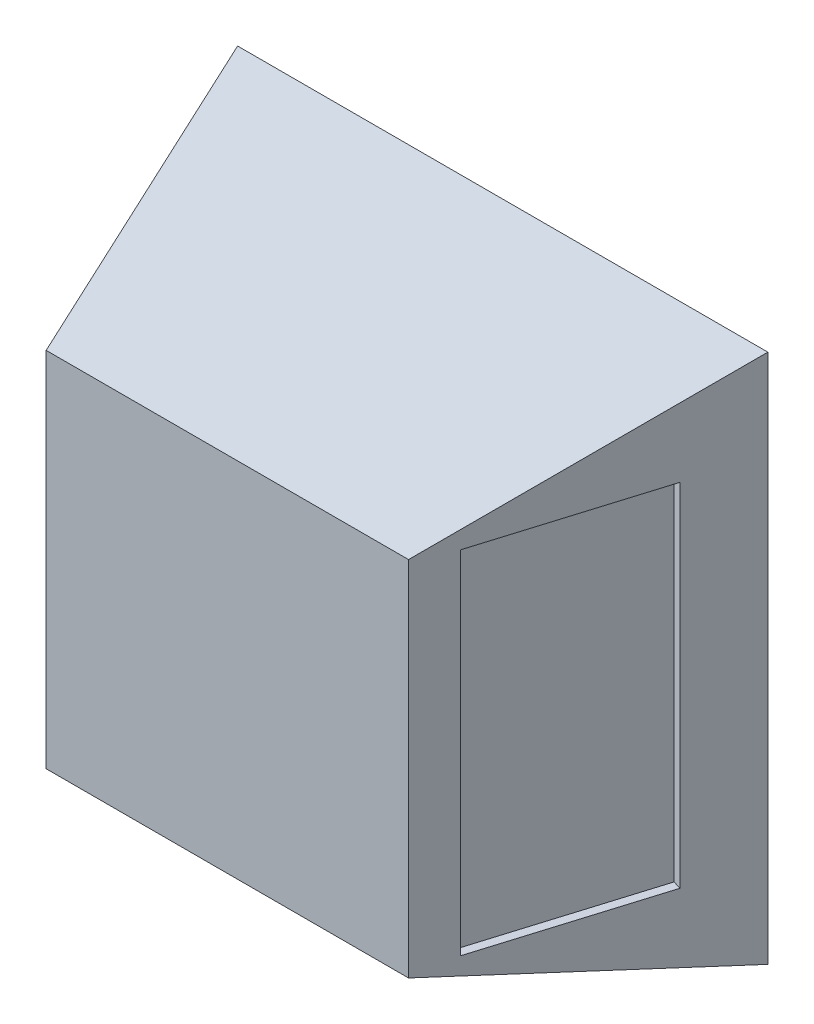
ISO-10303-21;
HEADER;
FILE_DESCRIPTION(('STEP AP214'),'2;1');
FILE_NAME('part.step','',(''),(''),'','','');
FILE_SCHEMA(('AUTOMOTIVE_DESIGN { 1 0 10303 214 1 1 1 1 }'));
ENDSEC;
DATA;
#1=APPLICATION_CONTEXT('core data for automotive mechanical design processes');
#2=APPLICATION_PROTOCOL_DEFINITION('international standard','automotive_design',2000,#1);
#3=PRODUCT_CONTEXT('',#1,'mechanical');
#4=PRODUCT('Part','Part','',(#3));
#5=PRODUCT_RELATED_PRODUCT_CATEGORY('part','',(#4));
#6=PRODUCT_DEFINITION_FORMATION('','',#4);
#7=PRODUCT_DEFINITION_CONTEXT('part definition',#1,'design');
#8=PRODUCT_DEFINITION('design','',#6,#7);
#9=PRODUCT_DEFINITION_SHAPE('','',#8);
#10=(LENGTH_UNIT() NAMED_UNIT(*) SI_UNIT(.MILLI.,.METRE.));
#11=(NAMED_UNIT(*) PLANE_ANGLE_UNIT() SI_UNIT($,.RADIAN.));
#12=(NAMED_UNIT(*) SI_UNIT($,.STERADIAN.) SOLID_ANGLE_UNIT());
#13=UNCERTAINTY_MEASURE_WITH_UNIT(LENGTH_MEASURE(1.E-05),#10,'distance_accuracy_value','');
#14=(GEOMETRIC_REPRESENTATION_CONTEXT(3) GLOBAL_UNCERTAINTY_ASSIGNED_CONTEXT((#13)) GLOBAL_UNIT_ASSIGNED_CONTEXT((#10,
#11,#12)) REPRESENTATION_CONTEXT('',''));
#15=CARTESIAN_POINT('',(0.,0.,0.));
#16=DIRECTION('',(0.,0.,1.));
#17=DIRECTION('',(1.,0.,0.));
#18=AXIS2_PLACEMENT_3D('',#15,#16,#17);
#19=CARTESIAN_POINT('',(8.28075694670788,0.,2.52386900556575));
#20=DIRECTION('',(-0.956556724712148,0.,-0.29154627832982));
#21=DIRECTION('',(-0.29154627832982,0.,0.956556724712148));
#22=AXIS2_PLACEMENT_3D('',#19,#20,#21);
#23=PLANE('',#22);
#24=DIRECTION('',(-0.279893482934695,-0.279893482934695,0.91832416739481));
#25=VECTOR('',#24,1.);
#26=CARTESIAN_POINT('',(9.05,9.05,0.));
#27=LINE('',#26,#25);
#28=CARTESIAN_POINT('',(9.05,9.05,0.));
#29=VERTEX_POINT('',#28);
#30=CARTESIAN_POINT('',(6.185,6.185,9.4));
#31=VERTEX_POINT('',#30);
#32=EDGE_CURVE('E478',#29,#31,#27,.T.);
#33=ORIENTED_EDGE('',*,*,#32,.T.);
#34=DIRECTION('',(0.,1.,0.));
#35=VECTOR('',#34,1.);
#36=CARTESIAN_POINT('',(6.185,6.185,9.4));
#37=LINE('',#36,#35);
#38=CARTESIAN_POINT('',(6.185,-6.185,9.4));
#39=VERTEX_POINT('',#38);
#40=EDGE_CURVE('E563',#39,#31,#37,.T.);
#41=ORIENTED_EDGE('',*,*,#40,.F.);
#42=DIRECTION('',(-0.279893482934695,0.279893482934695,0.91832416739481));
#43=VECTOR('',#42,1.);
#44=CARTESIAN_POINT('',(9.05,-9.05,0.));
#45=LINE('',#44,#43);
#46=CARTESIAN_POINT('',(9.04999999999999,-9.05,0.));
#47=VERTEX_POINT('',#46);
#48=EDGE_CURVE('E543',#47,#39,#45,.T.);
#49=ORIENTED_EDGE('',*,*,#48,.F.);
#50=DIRECTION('',(0.,1.,0.));
#51=VECTOR('',#50,1.);
#52=CARTESIAN_POINT('',(9.05,9.05,0.));
#53=LINE('',#52,#51);
#54=EDGE_CURVE('E432',#47,#29,#53,.T.);
#55=ORIENTED_EDGE('',*,*,#54,.T.);
#56=EDGE_LOOP('',(#33,#41,#49,#55));
#57=FACE_BOUND('',#56,.T.);
#58=DIRECTION('',(0.291546278329819,0.,-0.956556724712148));
#59=VECTOR('',#58,1.);
#60=CARTESIAN_POINT('',(6.59974808821075,6.,8.03922093222304));
#61=LINE('',#60,#59);
#62=CARTESIAN_POINT('',(6.59974808821075,6.,8.03922093222304));
#63=VERTEX_POINT('',#62);
#64=CARTESIAN_POINT('',(8.34902575818966,6.,2.29988058395015));
#65=VERTEX_POINT('',#64);
#66=EDGE_CURVE('E65',#63,#65,#61,.T.);
#67=ORIENTED_EDGE('',*,*,#66,.T.);
#68=DIRECTION('',(0.,-1.,0.));
#69=VECTOR('',#68,1.);
#70=CARTESIAN_POINT('',(8.34902575818966,6.,2.29988058395015));
#71=LINE('',#70,#69);
#72=CARTESIAN_POINT('',(8.34902575818966,-6.,2.29988058395015));
#73=VERTEX_POINT('',#72);
#74=EDGE_CURVE('E258',#65,#73,#71,.T.);
#75=ORIENTED_EDGE('',*,*,#74,.T.);
#76=DIRECTION('',(-0.291546278329819,0.,0.956556724712148));
#77=VECTOR('',#76,1.);
#78=CARTESIAN_POINT('',(6.59974808821075,-6.,8.03922093222304));
#79=LINE('',#78,#77);
#80=CARTESIAN_POINT('',(6.59974808821075,-6.,8.03922093222304));
#81=VERTEX_POINT('',#80);
#82=EDGE_CURVE('E1030',#73,#81,#79,.T.);
#83=ORIENTED_EDGE('',*,*,#82,.T.);
#84=DIRECTION('',(0.,1.,0.));
#85=VECTOR('',#84,1.);
#86=CARTESIAN_POINT('',(6.59974808821075,6.,8.03922093222304));
#87=LINE('',#86,#85);
#88=EDGE_CURVE('E254',#81,#63,#87,.T.);
#89=ORIENTED_EDGE('',*,*,#88,.T.);
#90=EDGE_LOOP('',(#67,#75,#83,#89));
#91=FACE_BOUND('',#90,.T.);
#92=ADVANCED_FACE('F48',(#57,#91),#23,.F.);
#93=CARTESIAN_POINT('',(0.,0.,-4.));
#94=DIRECTION('',(0.,0.,1.));
#95=DIRECTION('',(1.,0.,0.));
#96=AXIS2_PLACEMENT_3D('',#93,#94,#95);
#97=PLANE('',#96);
#98=DIRECTION('',(1.,0.,0.));
#99=VECTOR('',#98,1.);
#100=CARTESIAN_POINT('',(-2.9,-2.,-4.));
#101=LINE('',#100,#99);
#102=CARTESIAN_POINT('',(0.729999999999999,-2.,-4.));
#103=VERTEX_POINT('',#102);
#104=CARTESIAN_POINT('',(2.9,-2.,-4.));
#105=VERTEX_POINT('',#104);
#106=EDGE_CURVE('E384',#103,#105,#101,.T.);
#107=ORIENTED_EDGE('',*,*,#106,.F.);
#108=DIRECTION('',(0.,-1.,0.));
#109=VECTOR('',#108,1.);
#110=CARTESIAN_POINT('',(0.729999999999999,-2.15,-4.));
#111=LINE('',#110,#109);
#112=CARTESIAN_POINT('',(0.729999999999999,-0.73,-4.));
#113=VERTEX_POINT('',#112);
#114=EDGE_CURVE('E275',#113,#103,#111,.T.);
#115=ORIENTED_EDGE('',*,*,#114,.F.);
#116=DIRECTION('',(-1.,0.,0.));
#117=VECTOR('',#116,1.);
#118=CARTESIAN_POINT('',(0.729999999999999,-0.73,-4.));
#119=LINE('',#118,#117);
#120=CARTESIAN_POINT('',(2.15,-0.73,-4.));
#121=VERTEX_POINT('',#120);
#122=EDGE_CURVE('E328',#121,#113,#119,.T.);
#123=ORIENTED_EDGE('',*,*,#122,.F.);
#124=DIRECTION('',(0.,-1.,0.));
#125=VECTOR('',#124,1.);
#126=CARTESIAN_POINT('',(2.15,0.73,-4.));
#127=LINE('',#126,#125);
#128=CARTESIAN_POINT('',(2.15,0.73,-4.));
#129=VERTEX_POINT('',#128);
#130=EDGE_CURVE('E324',#129,#121,#127,.T.);
#131=ORIENTED_EDGE('',*,*,#130,.F.);
#132=DIRECTION('',(1.,0.,0.));
#133=VECTOR('',#132,1.);
#134=CARTESIAN_POINT('',(0.73,0.73,-4.));
#135=LINE('',#134,#133);
#136=CARTESIAN_POINT('',(0.73,0.73,-4.));
#137=VERTEX_POINT('',#136);
#138=EDGE_CURVE('E320',#137,#129,#135,.T.);
#139=ORIENTED_EDGE('',*,*,#138,.F.);
#140=DIRECTION('',(0.,1.,0.));
#141=VECTOR('',#140,1.);
#142=CARTESIAN_POINT('',(0.729999999999999,0.,-4.));
#143=LINE('',#142,#141);
#144=CARTESIAN_POINT('',(0.73,2.,-4.));
#145=VERTEX_POINT('',#144);
#146=EDGE_CURVE('E58',#137,#145,#143,.T.);
#147=ORIENTED_EDGE('',*,*,#146,.T.);
#148=DIRECTION('',(-1.,0.,0.));
#149=VECTOR('',#148,1.);
#150=CARTESIAN_POINT('',(-2.9,2.,-4.));
#151=LINE('',#150,#149);
#152=CARTESIAN_POINT('',(2.9,2.,-4.));
#153=VERTEX_POINT('',#152);
#154=EDGE_CURVE('E391',#153,#145,#151,.T.);
#155=ORIENTED_EDGE('',*,*,#154,.F.);
#156=DIRECTION('',(0.,1.,0.));
#157=VECTOR('',#156,1.);
#158=CARTESIAN_POINT('',(2.9,2.,-4.));
#159=LINE('',#158,#157);
#160=EDGE_CURVE('E396',#105,#153,#159,.T.);
#161=ORIENTED_EDGE('',*,*,#160,.F.);
#162=EDGE_LOOP('',(#107,#115,#123,#131,#139,#147,#155,#161));
#163=FACE_BOUND('',#162,.T.);
#164=ADVANCED_FACE('F675',(#163),#97,.F.);
#165=CARTESIAN_POINT('',(0.,0.,6.9));
#166=DIRECTION('',(0.,0.,1.));
#167=DIRECTION('',(1.,0.,0.));
#168=AXIS2_PLACEMENT_3D('',#165,#166,#167);
#169=PLANE('',#168);
#170=DIRECTION('',(0.,1.,0.));
#171=VECTOR('',#170,1.);
#172=CARTESIAN_POINT('',(4.33342731390715,0.,6.9));
#173=LINE('',#172,#171);
#174=CARTESIAN_POINT('',(4.33342731390715,-4.33342731390715,6.9));
#175=VERTEX_POINT('',#174);
#176=CARTESIAN_POINT('',(4.33342731390715,4.33342731390715,6.9));
#177=VERTEX_POINT('',#176);
#178=EDGE_CURVE('E423',#175,#177,#173,.T.);
#179=ORIENTED_EDGE('',*,*,#178,.F.);
#180=DIRECTION('',(1.,0.,0.));
#181=VECTOR('',#180,1.);
#182=CARTESIAN_POINT('',(0.,-4.33342731390715,6.9));
#183=LINE('',#182,#181);
#184=CARTESIAN_POINT('',(-4.33342731390715,-4.33342731390715,6.9));
#185=VERTEX_POINT('',#184);
#186=EDGE_CURVE('E427',#185,#175,#183,.T.);
#187=ORIENTED_EDGE('',*,*,#186,.F.);
#188=DIRECTION('',(0.,-1.,0.));
#189=VECTOR('',#188,1.);
#190=CARTESIAN_POINT('',(-4.33342731390715,0.,6.9));
#191=LINE('',#190,#189);
#192=CARTESIAN_POINT('',(-4.33342731390715,4.33342731390715,6.9));
#193=VERTEX_POINT('',#192);
#194=EDGE_CURVE('E433',#193,#185,#191,.T.);
#195=ORIENTED_EDGE('',*,*,#194,.F.);
#196=DIRECTION('',(-1.,0.,0.));
#197=VECTOR('',#196,1.);
#198=CARTESIAN_POINT('',(0.,4.33342731390715,6.9));
#199=LINE('',#198,#197);
#200=EDGE_CURVE('E429',#177,#193,#199,.T.);
#201=ORIENTED_EDGE('',*,*,#200,.F.);
#202=EDGE_LOOP('',(#179,#187,#195,#201));
#203=FACE_BOUND('',#202,.T.);
#204=DIRECTION('',(0.,1.,0.));
#205=VECTOR('',#204,1.);
#206=CARTESIAN_POINT('',(2.9,2.,6.9));
#207=LINE('',#206,#205);
#208=CARTESIAN_POINT('',(2.9,-2.,6.9));
#209=VERTEX_POINT('',#208);
#210=CARTESIAN_POINT('',(2.9,2.,6.9));
#211=VERTEX_POINT('',#210);
#212=EDGE_CURVE('E408',#209,#211,#207,.T.);
#213=ORIENTED_EDGE('',*,*,#212,.T.);
#214=DIRECTION('',(-1.,0.,0.));
#215=VECTOR('',#214,1.);
#216=CARTESIAN_POINT('',(-2.9,2.,6.9));
#217=LINE('',#216,#215);
#218=CARTESIAN_POINT('',(-2.9,2.,6.9));
#219=VERTEX_POINT('',#218);
#220=EDGE_CURVE('E405',#211,#219,#217,.T.);
#221=ORIENTED_EDGE('',*,*,#220,.T.);
#222=DIRECTION('',(0.,-1.,0.));
#223=VECTOR('',#222,1.);
#224=CARTESIAN_POINT('',(-2.9,2.,6.9));
#225=LINE('',#224,#223);
#226=CARTESIAN_POINT('',(-2.9,-2.,6.9));
#227=VERTEX_POINT('',#226);
#228=EDGE_CURVE('E401',#219,#227,#225,.T.);
#229=ORIENTED_EDGE('',*,*,#228,.T.);
#230=DIRECTION('',(1.,0.,0.));
#231=VECTOR('',#230,1.);
#232=CARTESIAN_POINT('',(-2.9,-2.,6.9));
#233=LINE('',#232,#231);
#234=EDGE_CURVE('E383',#227,#209,#233,.T.);
#235=ORIENTED_EDGE('',*,*,#234,.T.);
#236=EDGE_LOOP('',(#213,#221,#229,#235));
#237=FACE_BOUND('',#236,.T.);
#238=ADVANCED_FACE('F708',(#203,#237),#169,.F.);
#239=CARTESIAN_POINT('',(0.,0.,9.4));
#240=DIRECTION('',(0.,0.,1.));
#241=DIRECTION('',(1.,0.,0.));
#242=AXIS2_PLACEMENT_3D('',#239,#240,#241);
#243=PLANE('',#242);
#244=ORIENTED_EDGE('',*,*,#40,.T.);
#245=DIRECTION('',(-1.,0.,0.));
#246=VECTOR('',#245,1.);
#247=CARTESIAN_POINT('',(-6.185,6.185,9.4));
#248=LINE('',#247,#246);
#249=CARTESIAN_POINT('',(-6.185,6.185,9.4));
#250=VERTEX_POINT('',#249);
#251=EDGE_CURVE('E582',#31,#250,#248,.T.);
#252=ORIENTED_EDGE('',*,*,#251,.T.);
#253=DIRECTION('',(0.,-1.,0.));
#254=VECTOR('',#253,1.);
#255=CARTESIAN_POINT('',(-6.185,6.185,9.4));
#256=LINE('',#255,#254);
#257=CARTESIAN_POINT('',(-6.185,-6.185,9.4));
#258=VERTEX_POINT('',#257);
#259=EDGE_CURVE('E513',#250,#258,#256,.T.);
#260=ORIENTED_EDGE('',*,*,#259,.T.);
#261=DIRECTION('',(1.,0.,0.));
#262=VECTOR('',#261,1.);
#263=CARTESIAN_POINT('',(-6.185,-6.185,9.4));
#264=LINE('',#263,#262);
#265=EDGE_CURVE('E652',#258,#39,#264,.T.);
#266=ORIENTED_EDGE('',*,*,#265,.T.);
#267=EDGE_LOOP('',(#244,#252,#260,#266));
#268=FACE_BOUND('',#267,.T.);
#269=ADVANCED_FACE('F50',(#268),#243,.T.);
#270=CARTESIAN_POINT('',(0.,0.,0.));
#271=DIRECTION('',(0.,0.,1.));
#272=DIRECTION('',(1.,0.,0.));
#273=AXIS2_PLACEMENT_3D('',#270,#271,#272);
#274=PLANE('',#273);
#275=DIRECTION('',(1.,0.,0.));
#276=VECTOR('',#275,1.);
#277=CARTESIAN_POINT('',(0.,-6.43645922880077,0.));
#278=LINE('',#277,#276);
#279=CARTESIAN_POINT('',(-6.43645922880077,-6.43645922880077,0.));
#280=VERTEX_POINT('',#279);
#281=CARTESIAN_POINT('',(6.43645922880077,-6.43645922880077,0.));
#282=VERTEX_POINT('',#281);
#283=EDGE_CURVE('E460',#280,#282,#278,.T.);
#284=ORIENTED_EDGE('',*,*,#283,.T.);
#285=DIRECTION('',(0.,1.,0.));
#286=VECTOR('',#285,1.);
#287=CARTESIAN_POINT('',(6.43645922880077,0.,0.));
#288=LINE('',#287,#286);
#289=CARTESIAN_POINT('',(6.43645922880077,6.43645922880077,0.));
#290=VERTEX_POINT('',#289);
#291=EDGE_CURVE('E404',#282,#290,#288,.T.);
#292=ORIENTED_EDGE('',*,*,#291,.T.);
#293=DIRECTION('',(-1.,0.,0.));
#294=VECTOR('',#293,1.);
#295=CARTESIAN_POINT('',(0.,6.43645922880077,0.));
#296=LINE('',#295,#294);
#297=CARTESIAN_POINT('',(-6.43645922880077,6.43645922880077,0.));
#298=VERTEX_POINT('',#297);
#299=EDGE_CURVE('E443',#290,#298,#296,.T.);
#300=ORIENTED_EDGE('',*,*,#299,.T.);
#301=DIRECTION('',(0.,-1.,0.));
#302=VECTOR('',#301,1.);
#303=CARTESIAN_POINT('',(-6.43645922880077,0.,0.));
#304=LINE('',#303,#302);
#305=EDGE_CURVE('E456',#298,#280,#304,.T.);
#306=ORIENTED_EDGE('',*,*,#305,.T.);
#307=EDGE_LOOP('',(#284,#292,#300,#306));
#308=FACE_BOUND('',#307,.T.);
#309=ORIENTED_EDGE('',*,*,#54,.F.);
#310=DIRECTION('',(1.,0.,0.));
#311=VECTOR('',#310,1.);
#312=CARTESIAN_POINT('',(-9.05,-9.05,0.));
#313=LINE('',#312,#311);
#314=CARTESIAN_POINT('',(-9.05,-9.04999999999999,0.));
#315=VERTEX_POINT('',#314);
#316=EDGE_CURVE('E551',#315,#47,#313,.T.);
#317=ORIENTED_EDGE('',*,*,#316,.F.);
#318=DIRECTION('',(0.,-1.,0.));
#319=VECTOR('',#318,1.);
#320=CARTESIAN_POINT('',(-9.05,9.05,0.));
#321=LINE('',#320,#319);
#322=CARTESIAN_POINT('',(-9.05,9.05,0.));
#323=VERTEX_POINT('',#322);
#324=EDGE_CURVE('E589',#323,#315,#321,.T.);
#325=ORIENTED_EDGE('',*,*,#324,.F.);
#326=DIRECTION('',(-1.,0.,0.));
#327=VECTOR('',#326,1.);
#328=CARTESIAN_POINT('',(-9.05,9.05,0.));
#329=LINE('',#328,#327);
#330=EDGE_CURVE('E472',#29,#323,#329,.T.);
#331=ORIENTED_EDGE('',*,*,#330,.F.);
#332=EDGE_LOOP('',(#309,#317,#325,#331));
#333=FACE_BOUND('',#332,.T.);
#334=ADVANCED_FACE('F491',(#308,#333),#274,.F.);
#335=CARTESIAN_POINT('',(0.,8.28075694670788,2.52386900556575));
#336=DIRECTION('',(0.,-0.956556724712148,-0.29154627832982));
#337=DIRECTION('',(0.,0.29154627832982,-0.956556724712148));
#338=AXIS2_PLACEMENT_3D('',#335,#336,#337);
#339=PLANE('',#338);
#340=DIRECTION('',(0.279893482934695,-0.279893482934695,0.91832416739481));
#341=VECTOR('',#340,1.);
#342=CARTESIAN_POINT('',(-9.05,9.05,0.));
#343=LINE('',#342,#341);
#344=EDGE_CURVE('E585',#323,#250,#343,.T.);
#345=ORIENTED_EDGE('',*,*,#344,.T.);
#346=ORIENTED_EDGE('',*,*,#251,.F.);
#347=ORIENTED_EDGE('',*,*,#32,.F.);
#348=ORIENTED_EDGE('',*,*,#330,.T.);
#349=EDGE_LOOP('',(#345,#346,#347,#348));
#350=FACE_BOUND('',#349,.T.);
#351=ADVANCED_FACE('F480',(#350),#339,.F.);
#352=CARTESIAN_POINT('',(-8.28075694670788,0.,2.52386900556575));
#353=DIRECTION('',(0.956556724712148,0.,-0.29154627832982));
#354=DIRECTION('',(-0.29154627832982,0.,-0.956556724712148));
#355=AXIS2_PLACEMENT_3D('',#352,#353,#354);
#356=PLANE('',#355);
#357=DIRECTION('',(0.279893482934695,0.279893482934695,0.91832416739481));
#358=VECTOR('',#357,1.);
#359=CARTESIAN_POINT('',(-9.05,-9.05,0.));
#360=LINE('',#359,#358);
#361=EDGE_CURVE('E535',#315,#258,#360,.T.);
#362=ORIENTED_EDGE('',*,*,#361,.T.);
#363=ORIENTED_EDGE('',*,*,#259,.F.);
#364=ORIENTED_EDGE('',*,*,#344,.F.);
#365=ORIENTED_EDGE('',*,*,#324,.T.);
#366=EDGE_LOOP('',(#362,#363,#364,#365));
#367=FACE_BOUND('',#366,.T.);
#368=ADVANCED_FACE('F490',(#367),#356,.F.);
#369=CARTESIAN_POINT('',(0.,-8.28075694670788,2.52386900556575));
#370=DIRECTION('',(0.,0.956556724712148,-0.29154627832982));
#371=DIRECTION('',(0.,0.29154627832982,0.956556724712148));
#372=AXIS2_PLACEMENT_3D('',#369,#370,#371);
#373=PLANE('',#372);
#374=ORIENTED_EDGE('',*,*,#48,.T.);
#375=ORIENTED_EDGE('',*,*,#265,.F.);
#376=ORIENTED_EDGE('',*,*,#361,.F.);
#377=ORIENTED_EDGE('',*,*,#316,.T.);
#378=EDGE_LOOP('',(#374,#375,#376,#377));
#379=FACE_BOUND('',#378,.T.);
#380=ADVANCED_FACE('F526',(#379),#373,.F.);
#381=CARTESIAN_POINT('',(0.,5.88936513492752,1.79500330974121));
#382=DIRECTION('',(0.,-0.956556724712148,-0.29154627832982));
#383=DIRECTION('',(0.,0.29154627832982,-0.956556724712148));
#384=AXIS2_PLACEMENT_3D('',#381,#382,#383);
#385=PLANE('',#384);
#386=DIRECTION('',(0.279893482934695,-0.279893482934695,0.91832416739481));
#387=VECTOR('',#386,1.);
#388=CARTESIAN_POINT('',(-5.42799013954792,5.42799013954792,3.30876420208613));
#389=LINE('',#388,#387);
#390=EDGE_CURVE('E438',#298,#193,#389,.T.);
#391=ORIENTED_EDGE('',*,*,#390,.F.);
#392=ORIENTED_EDGE('',*,*,#299,.F.);
#393=DIRECTION('',(-0.279893482934695,-0.279893482934695,0.91832416739481));
#394=VECTOR('',#393,1.);
#395=CARTESIAN_POINT('',(5.42799013954792,5.42799013954792,3.30876420208613));
#396=LINE('',#395,#394);
#397=EDGE_CURVE('E442',#290,#177,#396,.T.);
#398=ORIENTED_EDGE('',*,*,#397,.T.);
#399=ORIENTED_EDGE('',*,*,#200,.T.);
#400=EDGE_LOOP('',(#391,#392,#398,#399));
#401=FACE_BOUND('',#400,.T.);
#402=ADVANCED_FACE('F838',(#401),#385,.T.);
#403=CARTESIAN_POINT('',(5.88936513492752,0.,1.79500330974121));
#404=DIRECTION('',(-0.956556724712148,0.,-0.29154627832982));
#405=DIRECTION('',(-0.29154627832982,0.,0.956556724712148));
#406=AXIS2_PLACEMENT_3D('',#403,#404,#405);
#407=PLANE('',#406);
#408=ORIENTED_EDGE('',*,*,#397,.F.);
#409=ORIENTED_EDGE('',*,*,#291,.F.);
#410=DIRECTION('',(-0.279893482934695,0.279893482934695,0.91832416739481));
#411=VECTOR('',#410,1.);
#412=CARTESIAN_POINT('',(5.42799013954792,-5.42799013954792,3.30876420208613));
#413=LINE('',#412,#411);
#414=EDGE_CURVE('E428',#282,#175,#413,.T.);
#415=ORIENTED_EDGE('',*,*,#414,.T.);
#416=ORIENTED_EDGE('',*,*,#178,.T.);
#417=EDGE_LOOP('',(#408,#409,#415,#416));
#418=FACE_BOUND('',#417,.T.);
#419=ADVANCED_FACE('F833',(#418),#407,.T.);
#420=CARTESIAN_POINT('',(-5.88936513492752,0.,1.79500330974121));
#421=DIRECTION('',(0.956556724712148,0.,-0.29154627832982));
#422=DIRECTION('',(-0.29154627832982,0.,-0.956556724712148));
#423=AXIS2_PLACEMENT_3D('',#420,#421,#422);
#424=PLANE('',#423);
#425=DIRECTION('',(0.279893482934695,0.279893482934695,0.91832416739481));
#426=VECTOR('',#425,1.);
#427=CARTESIAN_POINT('',(-5.42799013954792,-5.42799013954792,3.30876420208613));
#428=LINE('',#427,#426);
#429=EDGE_CURVE('E446',#280,#185,#428,.T.);
#430=ORIENTED_EDGE('',*,*,#429,.F.);
#431=ORIENTED_EDGE('',*,*,#305,.F.);
#432=ORIENTED_EDGE('',*,*,#390,.T.);
#433=ORIENTED_EDGE('',*,*,#194,.T.);
#434=EDGE_LOOP('',(#430,#431,#432,#433));
#435=FACE_BOUND('',#434,.T.);
#436=ADVANCED_FACE('F828',(#435),#424,.T.);
#437=CARTESIAN_POINT('',(0.,-5.88936513492752,1.79500330974121));
#438=DIRECTION('',(0.,0.956556724712148,-0.29154627832982));
#439=DIRECTION('',(0.,0.29154627832982,0.956556724712148));
#440=AXIS2_PLACEMENT_3D('',#437,#438,#439);
#441=PLANE('',#440);
#442=ORIENTED_EDGE('',*,*,#414,.F.);
#443=ORIENTED_EDGE('',*,*,#283,.F.);
#444=ORIENTED_EDGE('',*,*,#429,.T.);
#445=ORIENTED_EDGE('',*,*,#186,.T.);
#446=EDGE_LOOP('',(#442,#443,#444,#445));
#447=FACE_BOUND('',#446,.T.);
#448=ADVANCED_FACE('F824',(#447),#441,.T.);
#449=CARTESIAN_POINT('',(2.9,2.,13.9455659815234));
#450=DIRECTION('',(-1.,0.,0.));
#451=DIRECTION('',(0.,0.,1.));
#452=AXIS2_PLACEMENT_3D('',#449,#450,#451);
#453=PLANE('',#452);
#454=ORIENTED_EDGE('',*,*,#212,.F.);
#455=DIRECTION('',(0.,0.,-1.));
#456=VECTOR('',#455,1.);
#457=CARTESIAN_POINT('',(2.9,-2.,13.9455659815234));
#458=LINE('',#457,#456);
#459=EDGE_CURVE('E378',#209,#105,#458,.T.);
#460=ORIENTED_EDGE('',*,*,#459,.T.);
#461=ORIENTED_EDGE('',*,*,#160,.T.);
#462=DIRECTION('',(0.,0.,-1.));
#463=VECTOR('',#462,1.);
#464=CARTESIAN_POINT('',(2.9,2.,13.9455659815234));
#465=LINE('',#464,#463);
#466=EDGE_CURVE('E400',#211,#153,#465,.T.);
#467=ORIENTED_EDGE('',*,*,#466,.F.);
#468=EDGE_LOOP('',(#454,#460,#461,#467));
#469=FACE_BOUND('',#468,.T.);
#470=ADVANCED_FACE('F687',(#469),#453,.F.);
#471=CARTESIAN_POINT('',(-2.9,2.,13.9455659815234));
#472=DIRECTION('',(0.,-1.,0.));
#473=DIRECTION('',(0.,0.,-1.));
#474=AXIS2_PLACEMENT_3D('',#471,#472,#473);
#475=PLANE('',#474);
#476=ORIENTED_EDGE('',*,*,#154,.T.);
#477=DIRECTION('',(0.,0.,1.));
#478=VECTOR('',#477,1.);
#479=CARTESIAN_POINT('',(0.73,2.,13.9455659815234));
#480=LINE('',#479,#478);
#481=CARTESIAN_POINT('',(0.73,2.,0.));
#482=VERTEX_POINT('',#481);
#483=EDGE_CURVE('E362',#145,#482,#480,.T.);
#484=ORIENTED_EDGE('',*,*,#483,.T.);
#485=DIRECTION('',(-1.,0.,0.));
#486=VECTOR('',#485,1.);
#487=CARTESIAN_POINT('',(-2.9,2.,0.));
#488=LINE('',#487,#486);
#489=CARTESIAN_POINT('',(-0.73,2.,0.));
#490=VERTEX_POINT('',#489);
#491=EDGE_CURVE('E374',#482,#490,#488,.T.);
#492=ORIENTED_EDGE('',*,*,#491,.T.);
#493=DIRECTION('',(0.,0.,-1.));
#494=VECTOR('',#493,1.);
#495=CARTESIAN_POINT('',(-0.73,2.,13.9455659815234));
#496=LINE('',#495,#494);
#497=CARTESIAN_POINT('',(-0.73,2.,-4.));
#498=VERTEX_POINT('',#497);
#499=EDGE_CURVE('E337',#490,#498,#496,.T.);
#500=ORIENTED_EDGE('',*,*,#499,.T.);
#501=CARTESIAN_POINT('',(-2.9,2.,-4.));
#502=VERTEX_POINT('',#501);
#503=EDGE_CURVE('E395',#498,#502,#151,.T.);
#504=ORIENTED_EDGE('',*,*,#503,.T.);
#505=DIRECTION('',(0.,0.,-1.));
#506=VECTOR('',#505,1.);
#507=CARTESIAN_POINT('',(-2.9,2.,13.9455659815234));
#508=LINE('',#507,#506);
#509=EDGE_CURVE('E390',#219,#502,#508,.T.);
#510=ORIENTED_EDGE('',*,*,#509,.F.);
#511=ORIENTED_EDGE('',*,*,#220,.F.);
#512=ORIENTED_EDGE('',*,*,#466,.T.);
#513=EDGE_LOOP('',(#476,#484,#492,#500,#504,#510,#511,#512));
#514=FACE_BOUND('',#513,.T.);
#515=ADVANCED_FACE('F681',(#514),#475,.F.);
#516=CARTESIAN_POINT('',(-2.9,2.,13.9455659815234));
#517=DIRECTION('',(1.,0.,0.));
#518=DIRECTION('',(0.,0.,-1.));
#519=AXIS2_PLACEMENT_3D('',#516,#517,#518);
#520=PLANE('',#519);
#521=ORIENTED_EDGE('',*,*,#228,.F.);
#522=ORIENTED_EDGE('',*,*,#509,.T.);
#523=DIRECTION('',(0.,-1.,0.));
#524=VECTOR('',#523,1.);
#525=CARTESIAN_POINT('',(-2.9,2.,-4.));
#526=LINE('',#525,#524);
#527=CARTESIAN_POINT('',(-2.9,-2.,-4.));
#528=VERTEX_POINT('',#527);
#529=EDGE_CURVE('E385',#502,#528,#526,.T.);
#530=ORIENTED_EDGE('',*,*,#529,.T.);
#531=DIRECTION('',(0.,0.,-1.));
#532=VECTOR('',#531,1.);
#533=CARTESIAN_POINT('',(-2.9,-2.,13.9455659815234));
#534=LINE('',#533,#532);
#535=EDGE_CURVE('E389',#227,#528,#534,.T.);
#536=ORIENTED_EDGE('',*,*,#535,.F.);
#537=EDGE_LOOP('',(#521,#522,#530,#536));
#538=FACE_BOUND('',#537,.T.);
#539=ADVANCED_FACE('F700',(#538),#520,.F.);
#540=CARTESIAN_POINT('',(-2.9,-2.,13.9455659815234));
#541=DIRECTION('',(0.,1.,0.));
#542=DIRECTION('',(0.,0.,1.));
#543=AXIS2_PLACEMENT_3D('',#540,#541,#542);
#544=PLANE('',#543);
#545=CARTESIAN_POINT('',(-0.73,-2.,-4.));
#546=VERTEX_POINT('',#545);
#547=EDGE_CURVE('E379',#528,#546,#101,.T.);
#548=ORIENTED_EDGE('',*,*,#547,.T.);
#549=DIRECTION('',(0.,0.,1.));
#550=VECTOR('',#549,1.);
#551=CARTESIAN_POINT('',(-0.73,-2.,13.9455659815234));
#552=LINE('',#551,#550);
#553=CARTESIAN_POINT('',(-0.73,-2.,0.));
#554=VERTEX_POINT('',#553);
#555=EDGE_CURVE('E370',#546,#554,#552,.T.);
#556=ORIENTED_EDGE('',*,*,#555,.T.);
#557=DIRECTION('',(1.,0.,0.));
#558=VECTOR('',#557,1.);
#559=CARTESIAN_POINT('',(-2.9,-2.,0.));
#560=LINE('',#559,#558);
#561=CARTESIAN_POINT('',(0.729999999999999,-2.,0.));
#562=VERTEX_POINT('',#561);
#563=EDGE_CURVE('E12',#554,#562,#560,.T.);
#564=ORIENTED_EDGE('',*,*,#563,.T.);
#565=DIRECTION('',(0.,0.,-1.));
#566=VECTOR('',#565,1.);
#567=CARTESIAN_POINT('',(0.729999999999999,-2.,13.9455659815234));
#568=LINE('',#567,#566);
#569=EDGE_CURVE('E366',#562,#103,#568,.T.);
#570=ORIENTED_EDGE('',*,*,#569,.T.);
#571=ORIENTED_EDGE('',*,*,#106,.T.);
#572=ORIENTED_EDGE('',*,*,#459,.F.);
#573=ORIENTED_EDGE('',*,*,#234,.F.);
#574=ORIENTED_EDGE('',*,*,#535,.T.);
#575=EDGE_LOOP('',(#548,#556,#564,#570,#571,#572,#573,#574));
#576=FACE_BOUND('',#575,.T.);
#577=ADVANCED_FACE('F705',(#576),#544,.F.);
#578=DIRECTION('',(-1.,0.,0.));
#579=VECTOR('',#578,1.);
#580=CARTESIAN_POINT('',(-0.73,-0.730000000000001,-4.));
#581=LINE('',#580,#579);
#582=CARTESIAN_POINT('',(-0.73,-0.730000000000001,-4.));
#583=VERTEX_POINT('',#582);
#584=CARTESIAN_POINT('',(-2.15,-0.730000000000001,-4.));
#585=VERTEX_POINT('',#584);
#586=EDGE_CURVE('E260',#583,#585,#581,.T.);
#587=ORIENTED_EDGE('',*,*,#586,.F.);
#588=DIRECTION('',(0.,-1.,0.));
#589=VECTOR('',#588,1.);
#590=CARTESIAN_POINT('',(-0.729999999999999,0.,-4.));
#591=LINE('',#590,#589);
#592=EDGE_CURVE('E635',#583,#546,#591,.T.);
#593=ORIENTED_EDGE('',*,*,#592,.T.);
#594=ORIENTED_EDGE('',*,*,#547,.F.);
#595=ORIENTED_EDGE('',*,*,#529,.F.);
#596=ORIENTED_EDGE('',*,*,#503,.F.);
#597=DIRECTION('',(0.,1.,0.));
#598=VECTOR('',#597,1.);
#599=CARTESIAN_POINT('',(-0.73,2.15,-4.));
#600=LINE('',#599,#598);
#601=CARTESIAN_POINT('',(-0.73,0.729999999999998,-4.));
#602=VERTEX_POINT('',#601);
#603=EDGE_CURVE('E317',#602,#498,#600,.T.);
#604=ORIENTED_EDGE('',*,*,#603,.F.);
#605=DIRECTION('',(1.,0.,0.));
#606=VECTOR('',#605,1.);
#607=CARTESIAN_POINT('',(-0.73,0.729999999999998,-4.));
#608=LINE('',#607,#606);
#609=CARTESIAN_POINT('',(-2.15,0.729999999999999,-4.));
#610=VERTEX_POINT('',#609);
#611=EDGE_CURVE('E313',#610,#602,#608,.T.);
#612=ORIENTED_EDGE('',*,*,#611,.F.);
#613=DIRECTION('',(0.,1.,0.));
#614=VECTOR('',#613,1.);
#615=CARTESIAN_POINT('',(-2.15,0.729999999999999,-4.));
#616=LINE('',#615,#614);
#617=EDGE_CURVE('E265',#585,#610,#616,.T.);
#618=ORIENTED_EDGE('',*,*,#617,.F.);
#619=EDGE_LOOP('',(#587,#593,#594,#595,#596,#604,#612,#618));
#620=FACE_BOUND('',#619,.T.);
#621=ADVANCED_FACE('F704',(#620),#97,.F.);
#622=CARTESIAN_POINT('',(0.,0.,0.));
#623=DIRECTION('',(0.,0.,1.));
#624=DIRECTION('',(1.,0.,0.));
#625=AXIS2_PLACEMENT_3D('',#622,#623,#624);
#626=PLANE('',#625);
#627=DIRECTION('',(0.,-1.,0.));
#628=VECTOR('',#627,1.);
#629=CARTESIAN_POINT('',(0.73,2.15,0.));
#630=LINE('',#629,#628);
#631=CARTESIAN_POINT('',(0.73,0.73,0.));
#632=VERTEX_POINT('',#631);
#633=EDGE_CURVE('E291',#482,#632,#630,.T.);
#634=ORIENTED_EDGE('',*,*,#633,.T.);
#635=DIRECTION('',(1.,0.,0.));
#636=VECTOR('',#635,1.);
#637=CARTESIAN_POINT('',(0.73,0.73,0.));
#638=LINE('',#637,#636);
#639=CARTESIAN_POINT('',(2.15,0.73,0.));
#640=VERTEX_POINT('',#639);
#641=EDGE_CURVE('E294',#632,#640,#638,.T.);
#642=ORIENTED_EDGE('',*,*,#641,.T.);
#643=DIRECTION('',(0.,-1.,0.));
#644=VECTOR('',#643,1.);
#645=CARTESIAN_POINT('',(2.15,0.73,0.));
#646=LINE('',#645,#644);
#647=CARTESIAN_POINT('',(2.15,-0.73,0.));
#648=VERTEX_POINT('',#647);
#649=EDGE_CURVE('E298',#640,#648,#646,.T.);
#650=ORIENTED_EDGE('',*,*,#649,.T.);
#651=DIRECTION('',(-1.,0.,0.));
#652=VECTOR('',#651,1.);
#653=CARTESIAN_POINT('',(0.729999999999999,-0.73,0.));
#654=LINE('',#653,#652);
#655=CARTESIAN_POINT('',(0.729999999999999,-0.73,0.));
#656=VERTEX_POINT('',#655);
#657=EDGE_CURVE('E302',#648,#656,#654,.T.);
#658=ORIENTED_EDGE('',*,*,#657,.T.);
#659=DIRECTION('',(0.,-1.,0.));
#660=VECTOR('',#659,1.);
#661=CARTESIAN_POINT('',(0.729999999999999,-2.15,0.));
#662=LINE('',#661,#660);
#663=EDGE_CURVE('E306',#656,#562,#662,.T.);
#664=ORIENTED_EDGE('',*,*,#663,.T.);
#665=ORIENTED_EDGE('',*,*,#563,.F.);
#666=DIRECTION('',(0.,1.,0.));
#667=VECTOR('',#666,1.);
#668=CARTESIAN_POINT('',(-0.73,-2.15,0.));
#669=LINE('',#668,#667);
#670=CARTESIAN_POINT('',(-0.73,-0.730000000000001,0.));
#671=VERTEX_POINT('',#670);
#672=EDGE_CURVE('E271',#554,#671,#669,.T.);
#673=ORIENTED_EDGE('',*,*,#672,.T.);
#674=DIRECTION('',(-1.,0.,0.));
#675=VECTOR('',#674,1.);
#676=CARTESIAN_POINT('',(-0.73,-0.730000000000001,0.));
#677=LINE('',#676,#675);
#678=CARTESIAN_POINT('',(-2.15,-0.730000000000001,0.));
#679=VERTEX_POINT('',#678);
#680=EDGE_CURVE('E274',#671,#679,#677,.T.);
#681=ORIENTED_EDGE('',*,*,#680,.T.);
#682=DIRECTION('',(0.,1.,0.));
#683=VECTOR('',#682,1.);
#684=CARTESIAN_POINT('',(-2.15,0.729999999999999,0.));
#685=LINE('',#684,#683);
#686=CARTESIAN_POINT('',(-2.15,0.729999999999999,0.));
#687=VERTEX_POINT('',#686);
#688=EDGE_CURVE('E279',#679,#687,#685,.T.);
#689=ORIENTED_EDGE('',*,*,#688,.T.);
#690=DIRECTION('',(1.,0.,0.));
#691=VECTOR('',#690,1.);
#692=CARTESIAN_POINT('',(-0.73,0.729999999999998,0.));
#693=LINE('',#692,#691);
#694=CARTESIAN_POINT('',(-0.73,0.729999999999998,0.));
#695=VERTEX_POINT('',#694);
#696=EDGE_CURVE('E283',#687,#695,#693,.T.);
#697=ORIENTED_EDGE('',*,*,#696,.T.);
#698=DIRECTION('',(0.,1.,0.));
#699=VECTOR('',#698,1.);
#700=CARTESIAN_POINT('',(-0.73,2.15,0.));
#701=LINE('',#700,#699);
#702=EDGE_CURVE('E287',#695,#490,#701,.T.);
#703=ORIENTED_EDGE('',*,*,#702,.T.);
#704=ORIENTED_EDGE('',*,*,#491,.F.);
#705=EDGE_LOOP('',(#634,#642,#650,#658,#664,#665,#673,#681,#689,#697,#703,#704));
#706=FACE_BOUND('',#705,.T.);
#707=ADVANCED_FACE('F777',(#706),#626,.F.);
#708=CARTESIAN_POINT('',(-0.73,-2.15,0.));
#709=DIRECTION('',(-1.,0.,0.));
#710=DIRECTION('',(0.,-1.,0.));
#711=AXIS2_PLACEMENT_3D('',#708,#709,#710);
#712=PLANE('',#711);
#713=ORIENTED_EDGE('',*,*,#592,.F.);
#714=DIRECTION('',(0.,0.,-1.));
#715=VECTOR('',#714,1.);
#716=CARTESIAN_POINT('',(-0.73,-0.730000000000001,0.));
#717=LINE('',#716,#715);
#718=EDGE_CURVE('E73',#671,#583,#717,.T.);
#719=ORIENTED_EDGE('',*,*,#718,.F.);
#720=ORIENTED_EDGE('',*,*,#672,.F.);
#721=ORIENTED_EDGE('',*,*,#555,.F.);
#722=EDGE_LOOP('',(#713,#719,#720,#721));
#723=FACE_BOUND('',#722,.T.);
#724=ADVANCED_FACE('F780',(#723),#712,.F.);
#725=CARTESIAN_POINT('',(0.729999999999999,-2.15,0.));
#726=DIRECTION('',(1.,0.,0.));
#727=DIRECTION('',(0.,1.,0.));
#728=AXIS2_PLACEMENT_3D('',#725,#726,#727);
#729=PLANE('',#728);
#730=ORIENTED_EDGE('',*,*,#663,.F.);
#731=DIRECTION('',(0.,0.,-1.));
#732=VECTOR('',#731,1.);
#733=CARTESIAN_POINT('',(0.729999999999999,-0.73,0.));
#734=LINE('',#733,#732);
#735=EDGE_CURVE('E334',#656,#113,#734,.T.);
#736=ORIENTED_EDGE('',*,*,#735,.T.);
#737=ORIENTED_EDGE('',*,*,#114,.T.);
#738=ORIENTED_EDGE('',*,*,#569,.F.);
#739=EDGE_LOOP('',(#730,#736,#737,#738));
#740=FACE_BOUND('',#739,.T.);
#741=ADVANCED_FACE('F782',(#740),#729,.F.);
#742=CARTESIAN_POINT('',(0.73,2.15,0.));
#743=DIRECTION('',(1.,0.,0.));
#744=DIRECTION('',(0.,1.,0.));
#745=AXIS2_PLACEMENT_3D('',#742,#743,#744);
#746=PLANE('',#745);
#747=ORIENTED_EDGE('',*,*,#146,.F.);
#748=DIRECTION('',(0.,0.,-1.));
#749=VECTOR('',#748,1.);
#750=CARTESIAN_POINT('',(0.73,0.73,0.));
#751=LINE('',#750,#749);
#752=EDGE_CURVE('E344',#632,#137,#751,.T.);
#753=ORIENTED_EDGE('',*,*,#752,.F.);
#754=ORIENTED_EDGE('',*,*,#633,.F.);
#755=ORIENTED_EDGE('',*,*,#483,.F.);
#756=EDGE_LOOP('',(#747,#753,#754,#755));
#757=FACE_BOUND('',#756,.T.);
#758=ADVANCED_FACE('F785',(#757),#746,.F.);
#759=CARTESIAN_POINT('',(-0.73,2.15,0.));
#760=DIRECTION('',(-1.,0.,0.));
#761=DIRECTION('',(0.,0.,1.));
#762=AXIS2_PLACEMENT_3D('',#759,#760,#761);
#763=PLANE('',#762);
#764=ORIENTED_EDGE('',*,*,#702,.F.);
#765=DIRECTION('',(0.,0.,-1.));
#766=VECTOR('',#765,1.);
#767=CARTESIAN_POINT('',(-0.73,0.729999999999998,0.));
#768=LINE('',#767,#766);
#769=EDGE_CURVE('E348',#695,#602,#768,.T.);
#770=ORIENTED_EDGE('',*,*,#769,.T.);
#771=ORIENTED_EDGE('',*,*,#603,.T.);
#772=ORIENTED_EDGE('',*,*,#499,.F.);
#773=EDGE_LOOP('',(#764,#770,#771,#772));
#774=FACE_BOUND('',#773,.T.);
#775=ADVANCED_FACE('F791',(#774),#763,.F.);
#776=CARTESIAN_POINT('',(0.729999999999999,-0.73,0.));
#777=DIRECTION('',(0.,-1.,0.));
#778=DIRECTION('',(0.,0.,-1.));
#779=AXIS2_PLACEMENT_3D('',#776,#777,#778);
#780=PLANE('',#779);
#781=ORIENTED_EDGE('',*,*,#122,.T.);
#782=ORIENTED_EDGE('',*,*,#735,.F.);
#783=ORIENTED_EDGE('',*,*,#657,.F.);
#784=DIRECTION('',(0.,0.,-1.));
#785=VECTOR('',#784,1.);
#786=CARTESIAN_POINT('',(2.15,-0.73,0.));
#787=LINE('',#786,#785);
#788=EDGE_CURVE('E338',#648,#121,#787,.T.);
#789=ORIENTED_EDGE('',*,*,#788,.T.);
#790=EDGE_LOOP('',(#781,#782,#783,#789));
#791=FACE_BOUND('',#790,.T.);
#792=ADVANCED_FACE('F787',(#791),#780,.F.);
#793=CARTESIAN_POINT('',(2.15,0.73,0.));
#794=DIRECTION('',(1.,0.,0.));
#795=DIRECTION('',(0.,1.,0.));
#796=AXIS2_PLACEMENT_3D('',#793,#794,#795);
#797=PLANE('',#796);
#798=ORIENTED_EDGE('',*,*,#130,.T.);
#799=ORIENTED_EDGE('',*,*,#788,.F.);
#800=ORIENTED_EDGE('',*,*,#649,.F.);
#801=DIRECTION('',(0.,0.,-1.));
#802=VECTOR('',#801,1.);
#803=CARTESIAN_POINT('',(2.15,0.73,0.));
#804=LINE('',#803,#802);
#805=EDGE_CURVE('E341',#640,#129,#804,.T.);
#806=ORIENTED_EDGE('',*,*,#805,.T.);
#807=EDGE_LOOP('',(#798,#799,#800,#806));
#808=FACE_BOUND('',#807,.T.);
#809=ADVANCED_FACE('F790',(#808),#797,.F.);
#810=CARTESIAN_POINT('',(0.73,0.73,0.));
#811=DIRECTION('',(0.,1.,0.));
#812=DIRECTION('',(-1.,0.,0.));
#813=AXIS2_PLACEMENT_3D('',#810,#811,#812);
#814=PLANE('',#813);
#815=ORIENTED_EDGE('',*,*,#138,.T.);
#816=ORIENTED_EDGE('',*,*,#805,.F.);
#817=ORIENTED_EDGE('',*,*,#641,.F.);
#818=ORIENTED_EDGE('',*,*,#752,.T.);
#819=EDGE_LOOP('',(#815,#816,#817,#818));
#820=FACE_BOUND('',#819,.T.);
#821=ADVANCED_FACE('F795',(#820),#814,.F.);
#822=CARTESIAN_POINT('',(-0.73,0.729999999999998,0.));
#823=DIRECTION('',(0.,1.,0.));
#824=DIRECTION('',(-1.,0.,0.));
#825=AXIS2_PLACEMENT_3D('',#822,#823,#824);
#826=PLANE('',#825);
#827=ORIENTED_EDGE('',*,*,#611,.T.);
#828=ORIENTED_EDGE('',*,*,#769,.F.);
#829=ORIENTED_EDGE('',*,*,#696,.F.);
#830=DIRECTION('',(0.,0.,-1.));
#831=VECTOR('',#830,1.);
#832=CARTESIAN_POINT('',(-2.15,0.729999999999999,0.));
#833=LINE('',#832,#831);
#834=EDGE_CURVE('E351',#687,#610,#833,.T.);
#835=ORIENTED_EDGE('',*,*,#834,.T.);
#836=EDGE_LOOP('',(#827,#828,#829,#835));
#837=FACE_BOUND('',#836,.T.);
#838=ADVANCED_FACE('F799',(#837),#826,.F.);
#839=CARTESIAN_POINT('',(-2.15,0.729999999999999,0.));
#840=DIRECTION('',(-1.,0.,0.));
#841=DIRECTION('',(0.,-1.,0.));
#842=AXIS2_PLACEMENT_3D('',#839,#840,#841);
#843=PLANE('',#842);
#844=ORIENTED_EDGE('',*,*,#617,.T.);
#845=ORIENTED_EDGE('',*,*,#834,.F.);
#846=ORIENTED_EDGE('',*,*,#688,.F.);
#847=DIRECTION('',(0.,0.,-1.));
#848=VECTOR('',#847,1.);
#849=CARTESIAN_POINT('',(-2.15,-0.730000000000001,0.));
#850=LINE('',#849,#848);
#851=EDGE_CURVE('E354',#679,#585,#850,.T.);
#852=ORIENTED_EDGE('',*,*,#851,.T.);
#853=EDGE_LOOP('',(#844,#845,#846,#852));
#854=FACE_BOUND('',#853,.T.);
#855=ADVANCED_FACE('F808',(#854),#843,.F.);
#856=CARTESIAN_POINT('',(-0.73,-0.730000000000001,0.));
#857=DIRECTION('',(0.,-1.,0.));
#858=DIRECTION('',(1.,0.,0.));
#859=AXIS2_PLACEMENT_3D('',#856,#857,#858);
#860=PLANE('',#859);
#861=ORIENTED_EDGE('',*,*,#586,.T.);
#862=ORIENTED_EDGE('',*,*,#851,.F.);
#863=ORIENTED_EDGE('',*,*,#680,.F.);
#864=ORIENTED_EDGE('',*,*,#718,.T.);
#865=EDGE_LOOP('',(#861,#862,#863,#864));
#866=FACE_BOUND('',#865,.T.);
#867=ADVANCED_FACE('F730',(#866),#860,.F.);
#868=CARTESIAN_POINT('',(6.3127810707971,6.,7.95175704872409));
#869=DIRECTION('',(0.,-1.,0.));
#870=DIRECTION('',(0.,0.,-1.));
#871=AXIS2_PLACEMENT_3D('',#868,#869,#870);
#872=PLANE('',#871);
#873=ORIENTED_EDGE('',*,*,#66,.F.);
#874=DIRECTION('',(0.956556724712148,0.,0.29154627832982));
#875=VECTOR('',#874,1.);
#876=CARTESIAN_POINT('',(6.3127810707971,6.,7.95175704872409));
#877=LINE('',#876,#875);
#878=CARTESIAN_POINT('',(6.3127810707971,6.,7.95175704872409));
#879=VERTEX_POINT('',#878);
#880=EDGE_CURVE('E252',#879,#63,#877,.T.);
#881=ORIENTED_EDGE('',*,*,#880,.F.);
#882=DIRECTION('',(0.291546278329819,0.,-0.956556724712148));
#883=VECTOR('',#882,1.);
#884=CARTESIAN_POINT('',(6.3127810707971,6.,7.95175704872409));
#885=LINE('',#884,#883);
#886=CARTESIAN_POINT('',(8.06205874077602,6.,2.2124167004512));
#887=VERTEX_POINT('',#886);
#888=EDGE_CURVE('E243',#879,#887,#885,.T.);
#889=ORIENTED_EDGE('',*,*,#888,.T.);
#890=DIRECTION('',(0.956556724712148,0.,0.29154627832982));
#891=VECTOR('',#890,1.);
#892=CARTESIAN_POINT('',(8.06205874077602,6.,2.2124167004512));
#893=LINE('',#892,#891);
#894=EDGE_CURVE('E251',#887,#65,#893,.T.);
#895=ORIENTED_EDGE('',*,*,#894,.T.);
#896=EDGE_LOOP('',(#873,#881,#889,#895));
#897=FACE_BOUND('',#896,.T.);
#898=ADVANCED_FACE('F250',(#897),#872,.T.);
#899=CARTESIAN_POINT('',(8.06205874077602,6.,2.2124167004512));
#900=DIRECTION('',(-0.29154627832982,0.,0.956556724712148));
#901=DIRECTION('',(0.956556724712148,0.,0.29154627832982));
#902=AXIS2_PLACEMENT_3D('',#899,#900,#901);
#903=PLANE('',#902);
#904=ORIENTED_EDGE('',*,*,#74,.F.);
#905=ORIENTED_EDGE('',*,*,#894,.F.);
#906=DIRECTION('',(0.,-1.,0.));
#907=VECTOR('',#906,1.);
#908=CARTESIAN_POINT('',(8.06205874077602,6.,2.2124167004512));
#909=LINE('',#908,#907);
#910=CARTESIAN_POINT('',(8.06205874077602,-6.,2.2124167004512));
#911=VERTEX_POINT('',#910);
#912=EDGE_CURVE('E239',#887,#911,#909,.T.);
#913=ORIENTED_EDGE('',*,*,#912,.T.);
#914=DIRECTION('',(0.956556724712148,0.,0.29154627832982));
#915=VECTOR('',#914,1.);
#916=CARTESIAN_POINT('',(8.06205874077602,-6.,2.2124167004512));
#917=LINE('',#916,#915);
#918=EDGE_CURVE('E261',#911,#73,#917,.T.);
#919=ORIENTED_EDGE('',*,*,#918,.T.);
#920=EDGE_LOOP('',(#904,#905,#913,#919));
#921=FACE_BOUND('',#920,.T.);
#922=ADVANCED_FACE('F256',(#921),#903,.T.);
#923=CARTESIAN_POINT('',(6.3127810707971,-6.,7.95175704872409));
#924=DIRECTION('',(0.,1.,0.));
#925=DIRECTION('',(0.,0.,1.));
#926=AXIS2_PLACEMENT_3D('',#923,#924,#925);
#927=PLANE('',#926);
#928=ORIENTED_EDGE('',*,*,#82,.F.);
#929=ORIENTED_EDGE('',*,*,#918,.F.);
#930=DIRECTION('',(-0.291546278329819,0.,0.956556724712148));
#931=VECTOR('',#930,1.);
#932=CARTESIAN_POINT('',(6.3127810707971,-6.,7.95175704872409));
#933=LINE('',#932,#931);
#934=CARTESIAN_POINT('',(6.3127810707971,-6.,7.95175704872409));
#935=VERTEX_POINT('',#934);
#936=EDGE_CURVE('E244',#911,#935,#933,.T.);
#937=ORIENTED_EDGE('',*,*,#936,.T.);
#938=DIRECTION('',(0.956556724712148,0.,0.29154627832982));
#939=VECTOR('',#938,1.);
#940=CARTESIAN_POINT('',(6.3127810707971,-6.,7.95175704872409));
#941=LINE('',#940,#939);
#942=EDGE_CURVE('E267',#935,#81,#941,.T.);
#943=ORIENTED_EDGE('',*,*,#942,.T.);
#944=EDGE_LOOP('',(#928,#929,#937,#943));
#945=FACE_BOUND('',#944,.T.);
#946=ADVANCED_FACE('F745',(#945),#927,.T.);
#947=CARTESIAN_POINT('',(6.3127810707971,6.,7.95175704872409));
#948=DIRECTION('',(0.29154627832982,0.,-0.956556724712148));
#949=DIRECTION('',(-0.956556724712148,0.,-0.29154627832982));
#950=AXIS2_PLACEMENT_3D('',#947,#948,#949);
#951=PLANE('',#950);
#952=ORIENTED_EDGE('',*,*,#88,.F.);
#953=ORIENTED_EDGE('',*,*,#942,.F.);
#954=DIRECTION('',(0.,1.,0.));
#955=VECTOR('',#954,1.);
#956=CARTESIAN_POINT('',(6.3127810707971,6.,7.95175704872409));
#957=LINE('',#956,#955);
#958=EDGE_CURVE('E1040',#935,#879,#957,.T.);
#959=ORIENTED_EDGE('',*,*,#958,.T.);
#960=ORIENTED_EDGE('',*,*,#880,.T.);
#961=EDGE_LOOP('',(#952,#953,#959,#960));
#962=FACE_BOUND('',#961,.T.);
#963=ADVANCED_FACE('F754',(#962),#951,.T.);
#964=CARTESIAN_POINT('',(7.99378992929424,0.,2.43640512206681));
#965=DIRECTION('',(-0.956556724712148,0.,-0.291546278329819));
#966=DIRECTION('',(-0.291546278329819,0.,0.956556724712148));
#967=AXIS2_PLACEMENT_3D('',#964,#965,#966);
#968=PLANE('',#967);
#969=ORIENTED_EDGE('',*,*,#888,.F.);
#970=ORIENTED_EDGE('',*,*,#958,.F.);
#971=ORIENTED_EDGE('',*,*,#936,.F.);
#972=ORIENTED_EDGE('',*,*,#912,.F.);
#973=EDGE_LOOP('',(#969,#970,#971,#972));
#974=FACE_BOUND('',#973,.T.);
#975=ADVANCED_FACE('F241',(#974),#968,.F.);
#976=CLOSED_SHELL('',(#92,#164,#238,#269,#334,#351,#368,#380,#402,#419,#436,#448,#470,#515,#539,
#577,#621,#707,#724,#741,#758,#775,#792,#809,#821,#838,#855,#867,#898,#922,#946,#963,#975));
#977=MANIFOLD_SOLID_BREP('B2',#976);
#978=ADVANCED_BREP_SHAPE_REPRESENTATION('',(#18,#977),#14);
#979=SHAPE_DEFINITION_REPRESENTATION(#9,#978);
ENDSEC;
END-ISO-10303-21;
